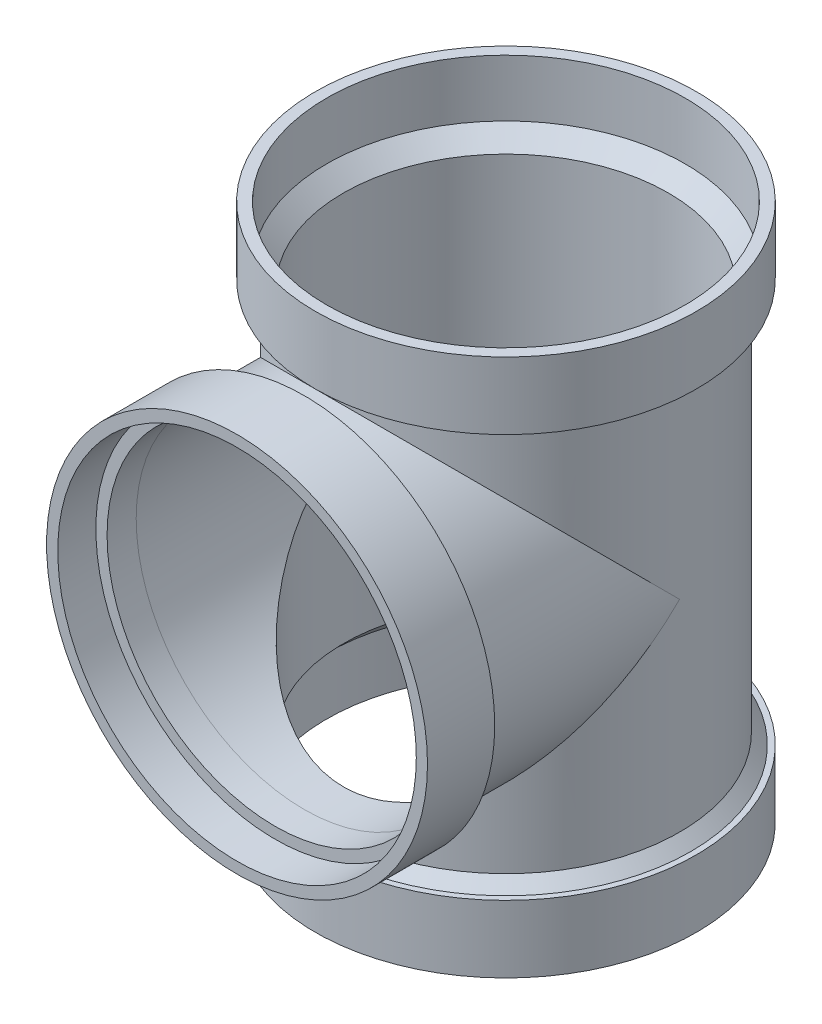
ISO-10303-21;
HEADER;
FILE_DESCRIPTION(('STEP AP214'),'2;1');
FILE_NAME('part.step','',(''),(''),'','','');
FILE_SCHEMA(('AUTOMOTIVE_DESIGN { 1 0 10303 214 1 1 1 1 }'));
ENDSEC;
DATA;
#1=APPLICATION_CONTEXT('core data for automotive mechanical design processes');
#2=APPLICATION_PROTOCOL_DEFINITION('international standard','automotive_design',2000,#1);
#3=PRODUCT_CONTEXT('',#1,'mechanical');
#4=PRODUCT('Part','Part','',(#3));
#5=PRODUCT_RELATED_PRODUCT_CATEGORY('part','',(#4));
#6=PRODUCT_DEFINITION_FORMATION('','',#4);
#7=PRODUCT_DEFINITION_CONTEXT('part definition',#1,'design');
#8=PRODUCT_DEFINITION('design','',#6,#7);
#9=PRODUCT_DEFINITION_SHAPE('','',#8);
#10=(LENGTH_UNIT() NAMED_UNIT(*) SI_UNIT(.MILLI.,.METRE.));
#11=(NAMED_UNIT(*) PLANE_ANGLE_UNIT() SI_UNIT($,.RADIAN.));
#12=(NAMED_UNIT(*) SI_UNIT($,.STERADIAN.) SOLID_ANGLE_UNIT());
#13=UNCERTAINTY_MEASURE_WITH_UNIT(LENGTH_MEASURE(1.E-05),#10,'distance_accuracy_value','');
#14=(GEOMETRIC_REPRESENTATION_CONTEXT(3) GLOBAL_UNCERTAINTY_ASSIGNED_CONTEXT((#13)) GLOBAL_UNIT_ASSIGNED_CONTEXT((#10,
#11,#12)) REPRESENTATION_CONTEXT('',''));
#15=CARTESIAN_POINT('',(0.,0.,0.));
#16=DIRECTION('',(0.,0.,1.));
#17=DIRECTION('',(1.,0.,0.));
#18=AXIS2_PLACEMENT_3D('',#15,#16,#17);
#19=CARTESIAN_POINT('',(0.,95.,120.));
#20=DIRECTION('',(0.,0.,-1.));
#21=DIRECTION('',(-1.,0.,0.));
#22=AXIS2_PLACEMENT_3D('',#19,#20,#21);
#23=CYLINDRICAL_SURFACE('',#22,85.);
#24=CARTESIAN_POINT('',(0.,95.,120.));
#25=DIRECTION('',(0.,0.,1.));
#26=DIRECTION('',(1.,0.,0.));
#27=AXIS2_PLACEMENT_3D('',#24,#25,#26);
#28=CIRCLE('',#27,85.);
#29=CARTESIAN_POINT('',(85.,95.,120.));
#30=VERTEX_POINT('',#29);
#31=EDGE_CURVE('E11',#30,#30,#28,.T.);
#32=ORIENTED_EDGE('',*,*,#31,.F.);
#33=EDGE_LOOP('',(#32));
#34=FACE_BOUND('',#33,.T.);
#35=CARTESIAN_POINT('',(0.,95.,90.));
#36=DIRECTION('',(0.,0.,1.));
#37=DIRECTION('',(1.,0.,0.));
#38=AXIS2_PLACEMENT_3D('',#35,#36,#37);
#39=CIRCLE('',#38,85.);
#40=CARTESIAN_POINT('',(85.,95.,90.));
#41=VERTEX_POINT('',#40);
#42=EDGE_CURVE('E43',#41,#41,#39,.T.);
#43=ORIENTED_EDGE('',*,*,#42,.T.);
#44=EDGE_LOOP('',(#43));
#45=FACE_BOUND('',#44,.T.);
#46=ADVANCED_FACE('F40',(#34,#45),#23,.T.);
#47=CARTESIAN_POINT('',(0.,95.,120.));
#48=DIRECTION('',(0.,0.,1.));
#49=DIRECTION('',(1.,0.,0.));
#50=AXIS2_PLACEMENT_3D('',#47,#48,#49);
#51=PLANE('',#50);
#52=CARTESIAN_POINT('',(0.,95.,120.));
#53=DIRECTION('',(0.,0.,1.));
#54=DIRECTION('',(1.,0.,0.));
#55=AXIS2_PLACEMENT_3D('',#52,#53,#54);
#56=CIRCLE('',#55,80.);
#57=CARTESIAN_POINT('',(80.,95.,120.));
#58=VERTEX_POINT('',#57);
#59=EDGE_CURVE('E52',#58,#58,#56,.T.);
#60=ORIENTED_EDGE('',*,*,#59,.F.);
#61=EDGE_LOOP('',(#60));
#62=FACE_BOUND('',#61,.T.);
#63=ORIENTED_EDGE('',*,*,#31,.T.);
#64=EDGE_LOOP('',(#63));
#65=FACE_BOUND('',#64,.T.);
#66=ADVANCED_FACE('F80',(#62,#65),#51,.T.);
#67=CARTESIAN_POINT('',(0.,95.,90.));
#68=DIRECTION('',(0.,0.,1.));
#69=DIRECTION('',(1.,0.,0.));
#70=AXIS2_PLACEMENT_3D('',#67,#68,#69);
#71=PLANE('',#70);
#72=CARTESIAN_POINT('',(0.,95.,90.));
#73=DIRECTION('',(0.,0.,1.));
#74=DIRECTION('',(1.,0.,0.));
#75=AXIS2_PLACEMENT_3D('',#72,#73,#74);
#76=CIRCLE('',#75,75.);
#77=CARTESIAN_POINT('',(75.0000000000001,95.,90.));
#78=VERTEX_POINT('',#77);
#79=EDGE_CURVE('E55',#78,#78,#76,.T.);
#80=ORIENTED_EDGE('',*,*,#79,.T.);
#81=EDGE_LOOP('',(#80));
#82=FACE_BOUND('',#81,.T.);
#83=ORIENTED_EDGE('',*,*,#42,.F.);
#84=EDGE_LOOP('',(#83));
#85=FACE_BOUND('',#84,.T.);
#86=ADVANCED_FACE('F76',(#82,#85),#71,.F.);
#87=CARTESIAN_POINT('',(0.,95.,103.));
#88=DIRECTION('',(0.,0.,1.));
#89=DIRECTION('',(1.,0.,0.));
#90=AXIS2_PLACEMENT_3D('',#87,#88,#89);
#91=CYLINDRICAL_SURFACE('',#90,80.);
#92=CARTESIAN_POINT('',(0.,95.,103.));
#93=DIRECTION('',(0.,0.,1.));
#94=DIRECTION('',(1.,0.,0.));
#95=AXIS2_PLACEMENT_3D('',#92,#93,#94);
#96=CIRCLE('',#95,80.);
#97=CARTESIAN_POINT('',(80.,95.,103.));
#98=VERTEX_POINT('',#97);
#99=EDGE_CURVE('E50',#98,#98,#96,.T.);
#100=ORIENTED_EDGE('',*,*,#99,.F.);
#101=EDGE_LOOP('',(#100));
#102=FACE_BOUND('',#101,.T.);
#103=ORIENTED_EDGE('',*,*,#59,.T.);
#104=EDGE_LOOP('',(#103));
#105=FACE_BOUND('',#104,.T.);
#106=ADVANCED_FACE('F70',(#102,#105),#91,.F.);
#107=CARTESIAN_POINT('',(0.,95.,103.));
#108=DIRECTION('',(0.,0.,1.));
#109=DIRECTION('',(1.,0.,0.));
#110=AXIS2_PLACEMENT_3D('',#107,#108,#109);
#111=PLANE('',#110);
#112=CARTESIAN_POINT('',(0.,95.,103.));
#113=DIRECTION('',(0.,0.,1.));
#114=DIRECTION('',(1.,0.,0.));
#115=AXIS2_PLACEMENT_3D('',#112,#113,#114);
#116=CIRCLE('',#115,75.);
#117=CARTESIAN_POINT('',(75.0000000000001,95.,103.));
#118=VERTEX_POINT('',#117);
#119=EDGE_CURVE('E60',#118,#118,#116,.T.);
#120=ORIENTED_EDGE('',*,*,#119,.F.);
#121=EDGE_LOOP('',(#120));
#122=FACE_BOUND('',#121,.T.);
#123=ORIENTED_EDGE('',*,*,#99,.T.);
#124=EDGE_LOOP('',(#123));
#125=FACE_BOUND('',#124,.T.);
#126=ADVANCED_FACE('F67',(#122,#125),#111,.T.);
#127=CARTESIAN_POINT('',(0.,95.,86.));
#128=DIRECTION('',(0.,0.,1.));
#129=DIRECTION('',(1.,0.,0.));
#130=AXIS2_PLACEMENT_3D('',#127,#128,#129);
#131=CYLINDRICAL_SURFACE('',#130,75.);
#132=ORIENTED_EDGE('',*,*,#119,.T.);
#133=EDGE_LOOP('',(#132));
#134=FACE_BOUND('',#133,.T.);
#135=ORIENTED_EDGE('',*,*,#79,.F.);
#136=EDGE_LOOP('',(#135));
#137=FACE_BOUND('',#136,.T.);
#138=ADVANCED_FACE('F64',(#134,#137),#131,.F.);
#139=CLOSED_SHELL('',(#46,#66,#86,#106,#126,#138));
#140=MANIFOLD_SOLID_BREP('B2',#139);
#141=CARTESIAN_POINT('',(0.,180.,0.));
#142=DIRECTION('',(0.,-1.,0.));
#143=DIRECTION('',(0.,0.,-1.));
#144=AXIS2_PLACEMENT_3D('',#141,#142,#143);
#145=CYLINDRICAL_SURFACE('',#144,72.5);
#146=CARTESIAN_POINT('',(0.,177.071067811866,0.));
#147=DIRECTION('',(0.,1.,0.));
#148=DIRECTION('',(0.,0.,1.));
#149=AXIS2_PLACEMENT_3D('',#146,#147,#148);
#150=CIRCLE('',#149,72.5);
#151=CARTESIAN_POINT('',(0.,177.071067811866,72.5));
#152=VERTEX_POINT('',#151);
#153=EDGE_CURVE('E215',#152,#152,#150,.F.);
#154=ORIENTED_EDGE('',*,*,#153,.F.);
#155=EDGE_LOOP('',(#154));
#156=FACE_BOUND('',#155,.T.);
#157=CARTESIAN_POINT('',(0.,2.92893218813436,0.));
#158=DIRECTION('',(0.,-1.,0.));
#159=DIRECTION('',(0.,0.,-1.));
#160=AXIS2_PLACEMENT_3D('',#157,#158,#159);
#161=CIRCLE('',#160,72.5);
#162=CARTESIAN_POINT('',(0.,2.92893218813436,-72.5));
#163=VERTEX_POINT('',#162);
#164=EDGE_CURVE('E218',#163,#163,#161,.F.);
#165=ORIENTED_EDGE('',*,*,#164,.F.);
#166=EDGE_LOOP('',(#165));
#167=FACE_BOUND('',#166,.T.);
#168=CARTESIAN_POINT('',(-72.2512975662029,115.118399538731,5.99999999999999));
#169=CARTESIAN_POINT('',(-72.1896320592226,115.340001407671,6.74218732700312));
#170=CARTESIAN_POINT('',(-72.1175107104839,115.594968131052,7.47239234819426));
#171=CARTESIAN_POINT('',(-71.9542741023039,116.158125522939,8.90810881758213));
#172=CARTESIAN_POINT('',(-71.8632006292488,116.466198847667,9.61367066865861));
#173=CARTESIAN_POINT('',(-71.6643548158217,117.120964697219,10.9979971452176));
#174=CARTESIAN_POINT('',(-71.5566972369384,117.467387528215,11.6769084655194));
#175=CARTESIAN_POINT('',(-71.3253564543341,118.191332700096,13.0155748670471));
#176=CARTESIAN_POINT('',(-71.2016634047975,118.568874095549,13.6753178716912));
#177=CARTESIAN_POINT('',(-70.9399904567028,119.345113869486,14.97342128723));
#178=CARTESIAN_POINT('',(-70.802105499489,119.743663933769,15.6118902437345));
#179=CARTESIAN_POINT('',(-70.5119709410956,120.558739586386,16.8739805279914));
#180=CARTESIAN_POINT('',(-70.3597194211835,120.975267571726,17.4975998585273));
#181=CARTESIAN_POINT('',(-70.0409324309957,121.822999069983,18.7330082132028));
#182=CARTESIAN_POINT('',(-69.8743680525556,122.254231169603,19.3447700840935));
#183=CARTESIAN_POINT('',(-69.5274802276591,123.127396615613,20.556667183985));
#184=CARTESIAN_POINT('',(-69.3471558711446,123.569330668487,21.1568016406742));
#185=CARTESIAN_POINT('',(-68.791975141717,124.892603646989,22.9220549762271));
#186=CARTESIAN_POINT('',(-68.3976209879667,125.785611916961,24.0723525973401));
#187=CARTESIAN_POINT('',(-67.556878216792,127.589258074251,26.3396910601553));
#188=CARTESIAN_POINT('',(-67.1104821712687,128.499898462749,27.4567271256978));
#189=CARTESIAN_POINT('',(-66.1657015592968,130.329302100948,29.6612109536074));
#190=CARTESIAN_POINT('',(-65.6673310689152,131.248063089998,30.7486666270605));
#191=CARTESIAN_POINT('',(-64.6180836807082,133.087061201911,32.8965272492471));
#192=CARTESIAN_POINT('',(-64.0672097779804,134.007298237631,33.9569337366529));
#193=CARTESIAN_POINT('',(-62.9090049151822,135.849078717394,36.057642928206));
#194=CARTESIAN_POINT('',(-62.3013753201631,136.77060066326,37.0977999552434));
#195=CARTESIAN_POINT('',(-61.0314120607563,138.605177850855,39.1519446795182));
#196=CARTESIAN_POINT('',(-60.3690767952886,139.518232843909,40.1659316096903));
#197=CARTESIAN_POINT('',(-58.9889092649662,141.331484622859,42.1667542676614));
#198=CARTESIAN_POINT('',(-58.2710913153475,142.231684654952,43.1535969105246));
#199=CARTESIAN_POINT('',(-56.7788553033177,144.015444045273,45.0989372347732));
#200=CARTESIAN_POINT('',(-56.0044409395424,144.899004486179,46.0574367626713));
#201=CARTESIAN_POINT('',(-53.9967366967416,147.081836813142,48.4154389340264));
#202=CARTESIAN_POINT('',(-52.7273691905947,148.36843544815,49.7962177244006));
#203=CARTESIAN_POINT('',(-50.0553548068224,150.882247148154,52.4814027395546));
#204=CARTESIAN_POINT('',(-48.6527128802215,152.109462416636,53.7858117984938));
#205=CARTESIAN_POINT('',(-46.4493382362236,153.892687558977,55.6744214797132));
#206=CARTESIAN_POINT('',(-45.6993822892687,154.476752259101,56.2918422500715));
#207=CARTESIAN_POINT('',(-44.1655563314284,155.624425115293,57.503117245975));
#208=CARTESIAN_POINT('',(-43.3816886250874,156.188034656662,58.0969730676836));
#209=CARTESIAN_POINT('',(-41.780188331391,157.292549701151,59.2591290888245));
#210=CARTESIAN_POINT('',(-40.9625658772732,157.833461921129,59.8274368523415));
#211=CARTESIAN_POINT('',(-39.2932572361983,158.89065913119,60.9368080899365));
#212=CARTESIAN_POINT('',(-38.441562631805,159.406937965718,61.4778647561883));
#213=CARTESIAN_POINT('',(-36.2278673716127,160.688331737461,62.8193055723285));
#214=CARTESIAN_POINT('',(-34.842258877126,161.434564105032,63.5991048158266));
#215=CARTESIAN_POINT('',(-31.992791780489,162.852724959347,65.0790829405953));
#216=CARTESIAN_POINT('',(-30.5289520732796,163.524671268931,65.7792809210872));
#217=CARTESIAN_POINT('',(-28.2777573824153,164.469645496383,66.7629380776318));
#218=CARTESIAN_POINT('',(-27.5179517306961,164.774204362715,67.0797777192118));
#219=CARTESIAN_POINT('',(-25.9806398250023,165.361089912641,67.6900286234472));
#220=CARTESIAN_POINT('',(-25.2031363523383,165.643420058928,67.9834435352037));
#221=CARTESIAN_POINT('',(-23.6311848381942,166.184676853794,68.5457074688372));
#222=CARTESIAN_POINT('',(-22.8367351576028,166.443601225661,68.8145541009513));
#223=CARTESIAN_POINT('',(-21.2319902370651,166.936827850582,69.3264877442858));
#224=CARTESIAN_POINT('',(-20.4216943312033,167.171129066233,69.5695736701813));
#225=CARTESIAN_POINT('',(-18.7790546070841,167.615960629208,70.0309325709879));
#226=CARTESIAN_POINT('',(-17.9465768595154,167.826253736602,70.2489580302815));
#227=CARTESIAN_POINT('',(-16.2682785792041,168.219436604842,70.6564842610258));
#228=CARTESIAN_POINT('',(-15.4224583143324,168.402326915067,70.8459856043369));
#229=CARTESIAN_POINT('',(-13.7190794734508,168.739681958581,71.195454740981));
#230=CARTESIAN_POINT('',(-12.8615204491686,168.894145603059,71.3554214030638));
#231=CARTESIAN_POINT('',(-11.136524654221,169.173723400368,71.6449066777339));
#232=CARTESIAN_POINT('',(-10.2690878952799,169.298837588031,71.7744253264574));
#233=CARTESIAN_POINT('',(-8.52704743184176,169.51885389158,72.0021558588007));
#234=CARTESIAN_POINT('',(-7.65245030869722,169.613781119988,72.1003937649507));
#235=CARTESIAN_POINT('',(-5.89747734616806,169.77296347453,72.2651127126968));
#236=CARTESIAN_POINT('',(-5.0171014572373,169.837218337334,72.3315934816511));
#237=CARTESIAN_POINT('',(-3.252904502853,169.934631492445,72.4323764882055));
#238=CARTESIAN_POINT('',(-2.36908388326904,169.967793683254,72.4666827599515));
#239=CARTESIAN_POINT('',(-0.600178896359542,170.002815032424,72.5029122541436));
#240=CARTESIAN_POINT('',(0.284905421928368,170.004675374113,72.5048367007445));
#241=CARTESIAN_POINT('',(1.92733973806951,169.979063694866,72.4783415870749));
#242=CARTESIAN_POINT('',(2.68483053840762,169.955754148818,72.4542280625029));
#243=CARTESIAN_POINT('',(4.197707191051,169.88626490592,72.3823373289776));
#244=CARTESIAN_POINT('',(4.95309286374434,169.840083314259,72.3345581594682));
#245=CARTESIAN_POINT('',(6.46011874137558,169.7250817506,72.2155667138044));
#246=CARTESIAN_POINT('',(7.21175971067282,169.65626660827,72.1443594368636));
#247=CARTESIAN_POINT('',(8.71017283892778,169.496313201458,71.978824207882));
#248=CARTESIAN_POINT('',(9.45694451119471,169.405172739615,71.8844939799729));
#249=CARTESIAN_POINT('',(10.9441958047331,169.20099629057,71.6731372133136));
#250=CARTESIAN_POINT('',(11.6846759667507,169.087962205376,71.5561126461342));
#251=CARTESIAN_POINT('',(13.1582066694996,168.840504231552,71.2998679160395));
#252=CARTESIAN_POINT('',(13.8912564822561,168.706078268231,71.1606456002737));
#253=CARTESIAN_POINT('',(16.0774239740364,168.271567224333,70.7105278615264));
#254=CARTESIAN_POINT('',(17.5178887602305,167.940203480804,70.3671345598543));
#255=CARTESIAN_POINT('',(20.3498279161734,167.201231210897,69.6008477244037));
#256=CARTESIAN_POINT('',(21.7414919306533,166.793968890796,69.178315136947));
#257=CARTESIAN_POINT('',(24.4764751388697,165.908166762384,68.2585777265714));
#258=CARTESIAN_POINT('',(25.8197961219495,165.429629595578,67.7613756709596));
#259=CARTESIAN_POINT('',(28.4537042017601,164.407372528501,66.6982359720379));
#260=CARTESIAN_POINT('',(29.7442760918068,163.863634007018,66.1322786919377));
#261=CARTESIAN_POINT('',(32.2692592613967,162.717189804734,64.9376317875545));
#262=CARTESIAN_POINT('',(33.5036585165944,162.114471584886,64.3089288230103));
#263=CARTESIAN_POINT('',(35.6047461262862,161.017604480351,63.163233045157));
#264=CARTESIAN_POINT('',(36.484579046668,160.535231047691,62.6589181000024));
#265=CARTESIAN_POINT('',(38.2111125021466,159.543797485095,61.621223773295));
#266=CARTESIAN_POINT('',(39.0578188386227,159.034742064779,61.0878495203291));
#267=CARTESIAN_POINT('',(41.5486824400541,157.470407994246,59.4467128219307));
#268=CARTESIAN_POINT('',(43.1431925736698,156.378167860431,58.2981517148027));
#269=CARTESIAN_POINT('',(46.200772108764,154.111068130151,55.9062964918539));
#270=CARTESIAN_POINT('',(47.6636348604648,152.93608362881,54.6628589105079));
#271=CARTESIAN_POINT('',(50.4574154459219,150.519896764381,52.0950892096274));
#272=CARTESIAN_POINT('',(51.7883389675483,149.278697259358,50.7707605812688));
#273=CARTESIAN_POINT('',(53.9126906113976,147.152621247478,48.4897609378488));
#274=CARTESIAN_POINT('',(54.7410889929162,146.281850591869,47.5521794087284));
#275=CARTESIAN_POINT('',(56.3398015513494,144.520112463766,45.646724854654));
#276=CARTESIAN_POINT('',(57.1101114114206,143.629143496623,44.678849585972));
#277=CARTESIAN_POINT('',(58.5939901681429,141.830590831933,42.7142901803575));
#278=CARTESIAN_POINT('',(59.3075288453804,140.922998597823,41.7175910802361));
#279=CARTESIAN_POINT('',(60.6784575548731,139.095683172028,39.6971684389369));
#280=CARTESIAN_POINT('',(61.3358492072697,138.175960331259,38.6734456786527));
#281=CARTESIAN_POINT('',(62.5977299595038,136.325329422128,36.5958573242087));
#282=CARTESIAN_POINT('',(63.2020218421131,135.394393146146,35.5418971766037));
#283=CARTESIAN_POINT('',(64.3559561010756,133.529381871512,33.4070858693088));
#284=CARTESIAN_POINT('',(64.9055957817513,132.595306720386,32.3262333864594));
#285=CARTESIAN_POINT('',(65.9504902962255,130.730573686854,30.1372338307803));
#286=CARTESIAN_POINT('',(66.4457853998774,129.799913774817,29.0291077237309));
#287=CARTESIAN_POINT('',(67.3828098512891,127.948939301659,26.7822450017147));
#288=CARTESIAN_POINT('',(67.8245463255615,127.028623378983,25.6435124839257));
#289=CARTESIAN_POINT('',(68.6404055202853,125.23949182511,23.3699408821966));
#290=CARTESIAN_POINT('',(69.0163199356357,124.369990102892,22.2362926137626));
#291=CARTESIAN_POINT('',(69.5423493868561,123.090482784491,20.5054841399503));
#292=CARTESIAN_POINT('',(69.7114370816318,122.66796367715,19.9232867690846));
#293=CARTESIAN_POINT('',(70.0367693974224,121.833768276253,18.747616839373));
#294=CARTESIAN_POINT('',(70.1930142178879,121.422091814379,18.1541444558051));
#295=CARTESIAN_POINT('',(70.4909708017723,120.616512850392,16.9601887089593));
#296=CARTESIAN_POINT('',(70.632806453159,120.222478714,16.3598253923411));
#297=CARTESIAN_POINT('',(70.9032453898772,119.451921420445,15.1448731257635));
#298=CARTESIAN_POINT('',(71.0318470645005,119.075400397853,14.5302824553165));
#299=CARTESIAN_POINT('',(71.2750730297203,118.345486283199,13.2859087633093));
#300=CARTESIAN_POINT('',(71.3897161586595,117.992062324956,12.6561476229773));
#301=CARTESIAN_POINT('',(71.6044165865293,117.314427284777,11.3787852998124));
#302=CARTESIAN_POINT('',(71.7044795510971,116.990204874352,10.7311911635551));
#303=CARTESIAN_POINT('',(71.8428054952445,116.532227978827,9.74531849589443));
#304=CARTESIAN_POINT('',(71.8869393723582,116.384341811011,9.41439872685337));
#305=CARTESIAN_POINT('',(71.971134594607,116.0992380139,8.74749970236861));
#306=CARTESIAN_POINT('',(72.0111963191463,115.962019390987,8.41152092163009));
#307=CARTESIAN_POINT('',(72.087256734937,115.698943486934,7.73269879245083));
#308=CARTESIAN_POINT('',(72.1232339565262,115.573146879327,7.38982940097658));
#309=CARTESIAN_POINT('',(72.190694736308,115.335165056385,6.69881798918418));
#310=CARTESIAN_POINT('',(72.2221764845696,115.222985326077,6.35067390725921));
#311=CARTESIAN_POINT('',(72.2512975662029,115.118399538731,5.99999999999997));
#312=B_SPLINE_CURVE_WITH_KNOTS('',3,(#168,#169,#170,#171,#172,#173,#174,#175,#176,#177,#178,
#179,#180,#181,#182,#183,#184,#185,#186,#187,#188,#189,#190,#191,#192,#193,#194,#195,#196,#197,
#198,#199,#200,#201,#202,#203,#204,#205,#206,#207,#208,#209,#210,#211,#212,#213,#214,#215,#216,
#217,#218,#219,#220,#221,#222,#223,#224,#225,#226,#227,#228,#229,#230,#231,#232,#233,#234,#235,
#236,#237,#238,#239,#240,#241,#242,#243,#244,#245,#246,#247,#248,#249,#250,#251,#252,#253,#254,
#255,#256,#257,#258,#259,#260,#261,#262,#263,#264,#265,#266,#267,#268,#269,#270,#271,#272,#273,
#274,#275,#276,#277,#278,#279,#280,#281,#282,#283,#284,#285,#286,#287,#288,#289,#290,#291,#292,
#293,#294,#295,#296,#297,#298,#299,#300,#301,#302,#303,#304,#305,#306,#307,#308,#309,#310,#311),
.UNSPECIFIED.,.F.,.F.,(4,2,2,2,2,2,2,2,2,2,2,2,2,2,2,2,2,2,2,2,2,2,2,2,2,2,2,2,2,2,2,2,2,2,2,2,
2,2,2,2,2,2,2,2,2,2,2,2,2,2,2,2,2,2,2,2,2,2,2,2,2,2,2,2,2,2,2,2,2,2,2,4),(0.,2.32858842888763,
4.6520960835242,6.96019308350509,9.26971403253767,11.5646813822946,13.8599556723906,
16.1599799648101,18.460156508414,22.9845345124142,27.5095590872475,32.0333613315611,
36.5569056663894,41.1057594371512,45.6547463871972,50.2025635338896,54.7500837412008,
61.5678486505753,68.385360385082,71.7850198284063,75.184448602572,78.5828641788943,
81.9821245733459,87.2463665311954,92.5093427292857,95.1419558085128,97.7741579761255,
100.406615906793,103.039184701565,105.695852778207,108.352467586029,111.009184127572,
113.665897516063,116.320394968405,118.974915209762,121.629102574,124.283189599746,
126.557190243335,128.831379305692,131.105083403924,133.379011380596,135.652741898204,
137.92669306806,142.473591996702,147.000236833881,151.526713951544,156.054486903459,
160.58322455712,163.951034346203,167.318251674372,174.054157903687,180.800459633947,
187.546470406084,192.117993945155,196.689856882475,201.264137372522,205.838285825537,
210.428762140063,215.019464764074,219.606742326175,224.193408833575,228.623704087291,
230.840375082804,233.05701164677,235.252604533933,237.448464331597,239.641326969616,
241.833335207961,242.928575011013,244.02371267642,245.124363544888,246.225456306544),.UNSPECIFIED.);
#313=CARTESIAN_POINT('',(-72.2512975662029,115.118399538731,5.99999999999999));
#314=VERTEX_POINT('',#313);
#315=CARTESIAN_POINT('',(72.2512975662029,115.118399538731,5.99999999999999));
#316=VERTEX_POINT('',#315);
#317=EDGE_CURVE('E173',#314,#316,#312,.T.);
#318=ORIENTED_EDGE('',*,*,#317,.F.);
#319=DIRECTION('',(0.,-1.,0.));
#320=VECTOR('',#319,1.);
#321=CARTESIAN_POINT('',(-72.2512975662029,180.,5.99999999999999));
#322=LINE('',#321,#320);
#323=CARTESIAN_POINT('',(-72.2512975662029,74.8816004612691,5.99999999999999));
#324=VERTEX_POINT('',#323);
#325=EDGE_CURVE('E38',#314,#324,#322,.T.);
#326=ORIENTED_EDGE('',*,*,#325,.T.);
#327=CARTESIAN_POINT('',(72.2512975662029,74.8816004612691,5.99999999999999));
#328=CARTESIAN_POINT('',(72.1896320592226,74.6599985923288,6.74218732700311));
#329=CARTESIAN_POINT('',(72.1175107104839,74.4050318689478,7.47239234819426));
#330=CARTESIAN_POINT('',(71.9542741023039,73.8418744770614,8.90810881758214));
#331=CARTESIAN_POINT('',(71.8632006292487,73.5338011523326,9.61367066865862));
#332=CARTESIAN_POINT('',(71.6643548158217,72.8790353027814,10.9979971452176));
#333=CARTESIAN_POINT('',(71.5566972369384,72.5326124717852,11.6769084655194));
#334=CARTESIAN_POINT('',(71.3253564543341,71.8086672999036,13.0155748670471));
#335=CARTESIAN_POINT('',(71.2016634047975,71.4311259044508,13.6753178716912));
#336=CARTESIAN_POINT('',(70.9399904567028,70.6548861305145,14.97342128723));
#337=CARTESIAN_POINT('',(70.802105499489,70.2563360662309,15.6118902437345));
#338=CARTESIAN_POINT('',(70.5119709410956,69.4412604136139,16.8739805279914));
#339=CARTESIAN_POINT('',(70.3597194211835,69.0247324282737,17.4975998585273));
#340=CARTESIAN_POINT('',(70.0409324309957,68.1770009300167,18.7330082132028));
#341=CARTESIAN_POINT('',(69.8743680525556,67.7457688303968,19.3447700840935));
#342=CARTESIAN_POINT('',(69.5274802276591,66.8726033843871,20.556667183985));
#343=CARTESIAN_POINT('',(69.3471558711446,66.4306693315128,21.1568016406742));
#344=CARTESIAN_POINT('',(68.7919751417171,65.1073963530112,22.9220549762271));
#345=CARTESIAN_POINT('',(68.3976209879667,64.2143880830394,24.0723525973401));
#346=CARTESIAN_POINT('',(67.5568782167921,62.4107419257491,26.3396910601552));
#347=CARTESIAN_POINT('',(67.1104821712688,61.5001015372509,27.4567271256977));
#348=CARTESIAN_POINT('',(66.1657015592968,59.6706978990518,29.6612109536074));
#349=CARTESIAN_POINT('',(65.6673310689152,58.7519369100016,30.7486666270605));
#350=CARTESIAN_POINT('',(64.6180836807082,56.9129387980885,32.8965272492471));
#351=CARTESIAN_POINT('',(64.0672097779804,55.9927017623687,33.9569337366529));
#352=CARTESIAN_POINT('',(62.9090049151822,54.1509212826059,36.057642928206));
#353=CARTESIAN_POINT('',(62.3013753201631,53.2293993367397,37.0977999552434));
#354=CARTESIAN_POINT('',(61.0314120607563,51.3948221491451,39.1519446795182));
#355=CARTESIAN_POINT('',(60.3690767952886,50.4817671560909,40.1659316096902));
#356=CARTESIAN_POINT('',(58.9889092649662,48.6685153771408,42.1667542676613));
#357=CARTESIAN_POINT('',(58.2710913153475,47.7683153450484,43.1535969105246));
#358=CARTESIAN_POINT('',(56.7788553033177,45.984555954727,45.0989372347731));
#359=CARTESIAN_POINT('',(56.0044409395424,45.1009955138208,46.0574367626712));
#360=CARTESIAN_POINT('',(53.9967366967417,42.9181631868581,48.4154389340263));
#361=CARTESIAN_POINT('',(52.7273691905948,41.6315645518505,49.7962177244006));
#362=CARTESIAN_POINT('',(50.0553548068224,39.1177528518458,52.4814027395546));
#363=CARTESIAN_POINT('',(48.6527128802215,37.8905375833644,53.7858117984938));
#364=CARTESIAN_POINT('',(46.4493382362236,36.1073124410228,55.6744214797132));
#365=CARTESIAN_POINT('',(45.6993822892687,35.5232477408989,56.2918422500715));
#366=CARTESIAN_POINT('',(44.1655563314284,34.3755748847072,57.503117245975));
#367=CARTESIAN_POINT('',(43.3816886250874,33.8119653433383,58.0969730676836));
#368=CARTESIAN_POINT('',(41.780188331391,32.7074502988494,59.2591290888245));
#369=CARTESIAN_POINT('',(40.9625658772732,32.166538078871,59.8274368523415));
#370=CARTESIAN_POINT('',(39.2932572361983,31.1093408688102,60.9368080899365));
#371=CARTESIAN_POINT('',(38.441562631805,30.5930620342816,61.4778647561883));
#372=CARTESIAN_POINT('',(36.2278673716127,29.3116682625392,62.8193055723285));
#373=CARTESIAN_POINT('',(34.8422588771261,28.5654358949677,63.5991048158266));
#374=CARTESIAN_POINT('',(31.992791780489,27.1472750406534,65.0790829405953));
#375=CARTESIAN_POINT('',(30.5289520732796,26.4753287310692,65.7792809210872));
#376=CARTESIAN_POINT('',(28.2777573824153,25.5303545036175,66.7629380776318));
#377=CARTESIAN_POINT('',(27.5179517306961,25.2257956372852,67.0797777192118));
#378=CARTESIAN_POINT('',(25.9806398250023,24.6389100873587,67.6900286234472));
#379=CARTESIAN_POINT('',(25.2031363523383,24.3565799410725,67.9834435352037));
#380=CARTESIAN_POINT('',(23.6311848381942,23.8153231462065,68.5457074688372));
#381=CARTESIAN_POINT('',(22.8367351576028,23.5563987743389,68.8145541009513));
#382=CARTESIAN_POINT('',(21.2319902370651,23.0631721494182,69.3264877442858));
#383=CARTESIAN_POINT('',(20.4216943312033,22.8288709337673,69.5695736701813));
#384=CARTESIAN_POINT('',(18.7790546070841,22.384039370792,70.0309325709879));
#385=CARTESIAN_POINT('',(17.9465768595154,22.1737462633979,70.2489580302815));
#386=CARTESIAN_POINT('',(16.2682785792041,21.780563395158,70.6564842610258));
#387=CARTESIAN_POINT('',(15.4224583143324,21.5976730849326,70.8459856043369));
#388=CARTESIAN_POINT('',(13.7190794734508,21.2603180414186,71.195454740981));
#389=CARTESIAN_POINT('',(12.8615204491686,21.1058543969413,71.3554214030638));
#390=CARTESIAN_POINT('',(11.136524654221,20.8262765996325,71.6449066777339));
#391=CARTESIAN_POINT('',(10.2690878952799,20.7011624119687,71.7744253264574));
#392=CARTESIAN_POINT('',(8.52704743184177,20.4811461084196,72.0021558588007));
#393=CARTESIAN_POINT('',(7.65245030869723,20.3862188800117,72.1003937649507));
#394=CARTESIAN_POINT('',(5.89747734616807,20.2270365254705,72.2651127126968));
#395=CARTESIAN_POINT('',(5.01710145723731,20.1627816626659,72.3315934816511));
#396=CARTESIAN_POINT('',(3.252904502853,20.0653685075553,72.4323764882055));
#397=CARTESIAN_POINT('',(2.36908388326904,20.0322063167465,72.4666827599515));
#398=CARTESIAN_POINT('',(0.600178896359544,19.997184967576,72.5029122541436));
#399=CARTESIAN_POINT('',(-0.284905421928371,19.9953246258865,72.5048367007445));
#400=CARTESIAN_POINT('',(-1.92733973806951,20.0209363051342,72.4783415870749));
#401=CARTESIAN_POINT('',(-2.68483053840761,20.0442458511821,72.4542280625029));
#402=CARTESIAN_POINT('',(-4.19770719105098,20.1137350940798,72.3823373289776));
#403=CARTESIAN_POINT('',(-4.95309286374432,20.1599166857407,72.3345581594682));
#404=CARTESIAN_POINT('',(-6.46011874137556,20.2749182493999,72.2155667138044));
#405=CARTESIAN_POINT('',(-7.21175971067279,20.3437333917302,72.1443594368636));
#406=CARTESIAN_POINT('',(-8.71017283892775,20.5036867985421,71.978824207882));
#407=CARTESIAN_POINT('',(-9.45694451119469,20.5948272603846,71.8844939799729));
#408=CARTESIAN_POINT('',(-10.9441958047331,20.7990037094302,71.6731372133136));
#409=CARTESIAN_POINT('',(-11.6846759667507,20.9120377946237,71.5561126461342));
#410=CARTESIAN_POINT('',(-13.1582066694996,21.1594957684478,71.2998679160395));
#411=CARTESIAN_POINT('',(-13.8912564822561,21.2939217317692,71.1606456002737));
#412=CARTESIAN_POINT('',(-16.0774239740364,21.7284327756668,70.7105278615264));
#413=CARTESIAN_POINT('',(-17.5178887602305,22.0597965191957,70.3671345598543));
#414=CARTESIAN_POINT('',(-20.3498279161734,22.7987687891031,69.6008477244037));
#415=CARTESIAN_POINT('',(-21.7414919306534,23.2060311092042,69.178315136947));
#416=CARTESIAN_POINT('',(-24.4764751388697,24.0918332376165,68.2585777265714));
#417=CARTESIAN_POINT('',(-25.8197961219495,24.5703704044224,67.7613756709596));
#418=CARTESIAN_POINT('',(-28.4537042017601,25.5926274714987,66.6982359720379));
#419=CARTESIAN_POINT('',(-29.7442760918068,26.1363659929824,66.1322786919377));
#420=CARTESIAN_POINT('',(-32.2692592613967,27.2828101952664,64.9376317875544));
#421=CARTESIAN_POINT('',(-33.5036585165944,27.8855284151143,64.3089288230103));
#422=CARTESIAN_POINT('',(-35.6047461262862,28.9823955196487,63.163233045157));
#423=CARTESIAN_POINT('',(-36.484579046668,29.4647689523094,62.6589181000023));
#424=CARTESIAN_POINT('',(-38.2111125021466,30.4562025149048,61.621223773295));
#425=CARTESIAN_POINT('',(-39.0578188386228,30.9652579352207,61.0878495203291));
#426=CARTESIAN_POINT('',(-41.5486824400541,32.5295920057538,59.4467128219307));
#427=CARTESIAN_POINT('',(-43.1431925736698,33.6218321395687,58.2981517148027));
#428=CARTESIAN_POINT('',(-46.200772108764,35.8889318698495,55.9062964918539));
#429=CARTESIAN_POINT('',(-47.6636348604649,37.0639163711897,54.6628589105079));
#430=CARTESIAN_POINT('',(-50.4574154459219,39.4801032356187,52.0950892096273));
#431=CARTESIAN_POINT('',(-51.7883389675483,40.7213027406424,50.7707605812688));
#432=CARTESIAN_POINT('',(-53.9126906113976,42.8473787525217,48.4897609378488));
#433=CARTESIAN_POINT('',(-54.7410889929162,43.7181494081312,47.5521794087283));
#434=CARTESIAN_POINT('',(-56.3398015513494,45.4798875362343,45.646724854654));
#435=CARTESIAN_POINT('',(-57.1101114114207,46.3708565033768,44.678849585972));
#436=CARTESIAN_POINT('',(-58.5939901681429,48.1694091680668,42.7142901803575));
#437=CARTESIAN_POINT('',(-59.3075288453804,49.0770014021766,41.7175910802361));
#438=CARTESIAN_POINT('',(-60.6784575548731,50.9043168279725,39.6971684389369));
#439=CARTESIAN_POINT('',(-61.3358492072697,51.824039668741,38.6734456786527));
#440=CARTESIAN_POINT('',(-62.5977299595038,53.6746705778719,36.5958573242087));
#441=CARTESIAN_POINT('',(-63.2020218421131,54.6056068538545,35.5418971766037));
#442=CARTESIAN_POINT('',(-64.3559561010756,56.4706181284876,33.4070858693088));
#443=CARTESIAN_POINT('',(-64.9055957817514,57.4046932796138,32.3262333864594));
#444=CARTESIAN_POINT('',(-65.9504902962255,59.2694263131466,30.1372338307802));
#445=CARTESIAN_POINT('',(-66.4457853998774,60.2000862251831,29.0291077237309));
#446=CARTESIAN_POINT('',(-67.3828098512891,62.0510606983416,26.7822450017147));
#447=CARTESIAN_POINT('',(-67.8245463255615,62.9713766210169,25.6435124839257));
#448=CARTESIAN_POINT('',(-68.6404055202853,64.7605081748903,23.3699408821965));
#449=CARTESIAN_POINT('',(-69.0163199356358,65.6300098971082,22.2362926137626));
#450=CARTESIAN_POINT('',(-69.5423493868561,66.9095172155088,20.5054841399503));
#451=CARTESIAN_POINT('',(-69.7114370816318,67.3320363228502,19.9232867690846));
#452=CARTESIAN_POINT('',(-70.0367693974224,68.1662317237467,18.747616839373));
#453=CARTESIAN_POINT('',(-70.1930142178879,68.5779081856213,18.154144455805));
#454=CARTESIAN_POINT('',(-70.4909708017724,69.3834871496084,16.9601887089592));
#455=CARTESIAN_POINT('',(-70.632806453159,69.7775212860006,16.359825392341));
#456=CARTESIAN_POINT('',(-70.9032453898772,70.5480785795554,15.1448731257635));
#457=CARTESIAN_POINT('',(-71.0318470645006,70.9245996021467,14.5302824553164));
#458=CARTESIAN_POINT('',(-71.2750730297204,71.6545137168011,13.2859087633092));
#459=CARTESIAN_POINT('',(-71.3897161586595,72.0079376750442,12.6561476229772));
#460=CARTESIAN_POINT('',(-71.6044165865293,72.6855727152236,11.3787852998123));
#461=CARTESIAN_POINT('',(-71.7044795510971,73.0097951256479,10.7311911635551));
#462=CARTESIAN_POINT('',(-71.8428054952445,73.4677720211736,9.7453184958944));
#463=CARTESIAN_POINT('',(-71.8869393723582,73.6156581889895,9.41439872685334));
#464=CARTESIAN_POINT('',(-71.971134594607,73.9007619861,8.74749970236856));
#465=CARTESIAN_POINT('',(-72.0111963191463,74.0379806090134,8.41152092163005));
#466=CARTESIAN_POINT('',(-72.087256734937,74.3010565130659,7.7326987924508));
#467=CARTESIAN_POINT('',(-72.1232339565262,74.4268531206732,7.38982940097656));
#468=CARTESIAN_POINT('',(-72.190694736308,74.6648349436153,6.69881798918418));
#469=CARTESIAN_POINT('',(-72.2221764845696,74.7770146739233,6.35067390725922));
#470=CARTESIAN_POINT('',(-72.2512975662029,74.8816004612691,5.99999999999995));
#471=B_SPLINE_CURVE_WITH_KNOTS('',3,(#327,#328,#329,#330,#331,#332,#333,#334,#335,#336,#337,
#338,#339,#340,#341,#342,#343,#344,#345,#346,#347,#348,#349,#350,#351,#352,#353,#354,#355,#356,
#357,#358,#359,#360,#361,#362,#363,#364,#365,#366,#367,#368,#369,#370,#371,#372,#373,#374,#375,
#376,#377,#378,#379,#380,#381,#382,#383,#384,#385,#386,#387,#388,#389,#390,#391,#392,#393,#394,
#395,#396,#397,#398,#399,#400,#401,#402,#403,#404,#405,#406,#407,#408,#409,#410,#411,#412,#413,
#414,#415,#416,#417,#418,#419,#420,#421,#422,#423,#424,#425,#426,#427,#428,#429,#430,#431,#432,
#433,#434,#435,#436,#437,#438,#439,#440,#441,#442,#443,#444,#445,#446,#447,#448,#449,#450,#451,
#452,#453,#454,#455,#456,#457,#458,#459,#460,#461,#462,#463,#464,#465,#466,#467,#468,#469,#470),
.UNSPECIFIED.,.F.,.F.,(4,2,2,2,2,2,2,2,2,2,2,2,2,2,2,2,2,2,2,2,2,2,2,2,2,2,2,2,2,2,2,2,2,2,2,2,
2,2,2,2,2,2,2,2,2,2,2,2,2,2,2,2,2,2,2,2,2,2,2,2,2,2,2,2,2,2,2,2,2,2,2,4),(0.,2.32858842888762,
4.65209608352421,6.96019308350509,9.26971403253764,11.5646813822945,13.8599556723906,
16.1599799648101,18.460156508414,22.9845345124141,27.5095590872475,32.033361331561,
36.5569056663894,41.1057594371511,45.6547463871971,50.2025635338895,54.7500837412007,
61.5678486505752,68.3853603850819,71.7850198284062,75.1844486025719,78.5828641788942,
81.9821245733459,87.2463665311954,92.5093427292856,95.1419558085127,97.7741579761255,
100.406615906793,103.039184701565,105.695852778207,108.352467586029,111.009184127572,
113.665897516063,116.320394968405,118.974915209762,121.629102574,124.283189599746,
126.557190243334,128.831379305692,131.105083403924,133.379011380596,135.652741898204,
137.92669306806,142.473591996702,147.000236833881,151.526713951544,156.054486903459,
160.58322455712,163.951034346203,167.318251674372,174.054157903687,180.800459633946,
187.546470406084,192.117993945155,196.689856882475,201.264137372522,205.838285825537,
210.428762140063,215.019464764074,219.606742326175,224.193408833575,228.623704087291,
230.840375082804,233.05701164677,235.252604533933,237.448464331597,239.641326969616,
241.833335207961,242.928575011013,244.02371267642,245.124363544888,246.225456306544),.UNSPECIFIED.);
#472=CARTESIAN_POINT('',(72.2512975662029,74.881600461269,5.99999999999999));
#473=VERTEX_POINT('',#472);
#474=EDGE_CURVE('E139',#473,#324,#471,.T.);
#475=ORIENTED_EDGE('',*,*,#474,.F.);
#476=DIRECTION('',(0.,-1.,0.));
#477=VECTOR('',#476,1.);
#478=CARTESIAN_POINT('',(72.2512975662029,180.,5.99999999999999));
#479=LINE('',#478,#477);
#480=EDGE_CURVE('E177',#473,#316,#479,.F.);
#481=ORIENTED_EDGE('',*,*,#480,.T.);
#482=EDGE_LOOP('',(#318,#326,#475,#481));
#483=FACE_BOUND('',#482,.T.);
#484=ADVANCED_FACE('F131',(#156,#167,#483),#145,.F.);
#485=CARTESIAN_POINT('',(0.,180.,0.));
#486=DIRECTION('',(0.,-1.,0.));
#487=DIRECTION('',(0.,0.,-1.));
#488=AXIS2_PLACEMENT_3D('',#485,#486,#487);
#489=CYLINDRICAL_SURFACE('',#488,77.5);
#490=CARTESIAN_POINT('',(0.,4.99999999999984,0.));
#491=DIRECTION('',(0.,-1.,0.));
#492=DIRECTION('',(0.,0.,-1.));
#493=AXIS2_PLACEMENT_3D('',#490,#491,#492);
#494=CIRCLE('',#493,77.5);
#495=CARTESIAN_POINT('',(0.,4.99999999999984,-77.5));
#496=VERTEX_POINT('',#495);
#497=EDGE_CURVE('E261',#496,#496,#494,.F.);
#498=ORIENTED_EDGE('',*,*,#497,.T.);
#499=EDGE_LOOP('',(#498));
#500=FACE_BOUND('',#499,.T.);
#501=CARTESIAN_POINT('',(0.,175.,0.));
#502=DIRECTION('',(0.,1.,0.));
#503=DIRECTION('',(0.,0.,1.));
#504=AXIS2_PLACEMENT_3D('',#501,#502,#503);
#505=CIRCLE('',#504,77.5);
#506=CARTESIAN_POINT('',(0.,175.,77.5));
#507=VERTEX_POINT('',#506);
#508=EDGE_CURVE('E258',#507,#507,#505,.F.);
#509=ORIENTED_EDGE('',*,*,#508,.T.);
#510=EDGE_LOOP('',(#509));
#511=FACE_BOUND('',#510,.T.);
#512=CARTESIAN_POINT('',(0.,95.,0.));
#513=DIRECTION('',(0.,-0.707106781186547,-0.707106781186547));
#514=DIRECTION('',(0.,-0.707106781186547,0.707106781186547));
#515=AXIS2_PLACEMENT_3D('',#512,#513,#514);
#516=ELLIPSE('',#515,109.601551083915,77.5);
#517=CARTESIAN_POINT('',(-77.5,95.,0.));
#518=VERTEX_POINT('',#517);
#519=CARTESIAN_POINT('',(77.5,95.,0.));
#520=VERTEX_POINT('',#519);
#521=EDGE_CURVE('E251',#518,#520,#516,.F.);
#522=ORIENTED_EDGE('',*,*,#521,.F.);
#523=CARTESIAN_POINT('',(0.,95.,0.));
#524=DIRECTION('',(0.,-0.707106781186547,0.707106781186547));
#525=DIRECTION('',(0.,-0.707106781186547,-0.707106781186547));
#526=AXIS2_PLACEMENT_3D('',#523,#524,#525);
#527=ELLIPSE('',#526,109.601551083915,77.5);
#528=EDGE_CURVE('E152',#520,#518,#527,.T.);
#529=ORIENTED_EDGE('',*,*,#528,.F.);
#530=EDGE_LOOP('',(#522,#529));
#531=FACE_BOUND('',#530,.T.);
#532=ADVANCED_FACE('F204',(#500,#511,#531),#489,.T.);
#533=CARTESIAN_POINT('',(0.,95.,90.));
#534=DIRECTION('',(0.,0.,-1.));
#535=DIRECTION('',(-1.,0.,0.));
#536=AXIS2_PLACEMENT_3D('',#533,#534,#535);
#537=CYLINDRICAL_SURFACE('',#536,77.5);
#538=CARTESIAN_POINT('',(0.,95.,90.));
#539=DIRECTION('',(0.,0.,1.));
#540=DIRECTION('',(1.,0.,0.));
#541=AXIS2_PLACEMENT_3D('',#538,#539,#540);
#542=CIRCLE('',#541,77.5);
#543=CARTESIAN_POINT('',(77.5,95.,90.));
#544=VERTEX_POINT('',#543);
#545=EDGE_CURVE('E245',#544,#544,#542,.T.);
#546=ORIENTED_EDGE('',*,*,#545,.F.);
#547=EDGE_LOOP('',(#546));
#548=FACE_BOUND('',#547,.T.);
#549=ORIENTED_EDGE('',*,*,#528,.T.);
#550=ORIENTED_EDGE('',*,*,#521,.T.);
#551=EDGE_LOOP('',(#549,#550));
#552=FACE_BOUND('',#551,.T.);
#553=ADVANCED_FACE('F209',(#548,#552),#537,.T.);
#554=CARTESIAN_POINT('',(0.,95.,90.));
#555=DIRECTION('',(0.,0.,1.));
#556=DIRECTION('',(1.,0.,0.));
#557=AXIS2_PLACEMENT_3D('',#554,#555,#556);
#558=PLANE('',#557);
#559=CARTESIAN_POINT('',(0.,95.,90.));
#560=DIRECTION('',(0.,0.,1.));
#561=DIRECTION('',(1.,0.,0.));
#562=AXIS2_PLACEMENT_3D('',#559,#560,#561);
#563=CIRCLE('',#562,75.);
#564=CARTESIAN_POINT('',(75.0000000000001,95.,90.));
#565=VERTEX_POINT('',#564);
#566=EDGE_CURVE('E223',#565,#565,#563,.T.);
#567=ORIENTED_EDGE('',*,*,#566,.F.);
#568=EDGE_LOOP('',(#567));
#569=FACE_BOUND('',#568,.T.);
#570=ORIENTED_EDGE('',*,*,#545,.T.);
#571=EDGE_LOOP('',(#570));
#572=FACE_BOUND('',#571,.T.);
#573=ADVANCED_FACE('F284',(#569,#572),#558,.T.);
#574=CARTESIAN_POINT('',(0.,0.,0.));
#575=DIRECTION('',(0.,-1.,0.));
#576=DIRECTION('',(0.,0.,-1.));
#577=AXIS2_PLACEMENT_3D('',#574,#575,#576);
#578=PLANE('',#577);
#579=CARTESIAN_POINT('',(0.,0.,0.));
#580=DIRECTION('',(0.,-1.,0.));
#581=DIRECTION('',(0.,0.,-1.));
#582=AXIS2_PLACEMENT_3D('',#579,#580,#581);
#583=CIRCLE('',#582,82.4999999999999);
#584=CARTESIAN_POINT('',(0.,0.,-82.4999999999999));
#585=VERTEX_POINT('',#584);
#586=EDGE_CURVE('E253',#585,#585,#583,.T.);
#587=ORIENTED_EDGE('',*,*,#586,.T.);
#588=EDGE_LOOP('',(#587));
#589=FACE_BOUND('',#588,.T.);
#590=CARTESIAN_POINT('',(0.,0.,0.));
#591=DIRECTION('',(0.,-1.,0.));
#592=DIRECTION('',(0.,0.,-1.));
#593=AXIS2_PLACEMENT_3D('',#590,#591,#592);
#594=CIRCLE('',#593,85.);
#595=CARTESIAN_POINT('',(0.,0.,-85.));
#596=VERTEX_POINT('',#595);
#597=EDGE_CURVE('E238',#596,#596,#594,.T.);
#598=ORIENTED_EDGE('',*,*,#597,.F.);
#599=EDGE_LOOP('',(#598));
#600=FACE_BOUND('',#599,.T.);
#601=ADVANCED_FACE('F290',(#589,#600),#578,.F.);
#602=CARTESIAN_POINT('',(0.,-30.,0.));
#603=DIRECTION('',(0.,1.,0.));
#604=DIRECTION('',(0.,0.,1.));
#605=AXIS2_PLACEMENT_3D('',#602,#603,#604);
#606=CYLINDRICAL_SURFACE('',#605,85.);
#607=CARTESIAN_POINT('',(0.,-30.,0.));
#608=DIRECTION('',(0.,-1.,0.));
#609=DIRECTION('',(0.,0.,-1.));
#610=AXIS2_PLACEMENT_3D('',#607,#608,#609);
#611=CIRCLE('',#610,85.);
#612=CARTESIAN_POINT('',(0.,-30.,-85.));
#613=VERTEX_POINT('',#612);
#614=EDGE_CURVE('E242',#613,#613,#611,.T.);
#615=ORIENTED_EDGE('',*,*,#614,.F.);
#616=EDGE_LOOP('',(#615));
#617=FACE_BOUND('',#616,.T.);
#618=ORIENTED_EDGE('',*,*,#597,.T.);
#619=EDGE_LOOP('',(#618));
#620=FACE_BOUND('',#619,.T.);
#621=ADVANCED_FACE('F295',(#617,#620),#606,.T.);
#622=CARTESIAN_POINT('',(0.,-30.,0.));
#623=DIRECTION('',(0.,-1.,0.));
#624=DIRECTION('',(0.,0.,-1.));
#625=AXIS2_PLACEMENT_3D('',#622,#623,#624);
#626=PLANE('',#625);
#627=CARTESIAN_POINT('',(0.,-30.,0.));
#628=DIRECTION('',(0.,-1.,0.));
#629=DIRECTION('',(0.,0.,-1.));
#630=AXIS2_PLACEMENT_3D('',#627,#628,#629);
#631=CIRCLE('',#630,80.);
#632=CARTESIAN_POINT('',(0.,-30.,-80.));
#633=VERTEX_POINT('',#632);
#634=EDGE_CURVE('E228',#633,#633,#631,.T.);
#635=ORIENTED_EDGE('',*,*,#634,.F.);
#636=EDGE_LOOP('',(#635));
#637=FACE_BOUND('',#636,.T.);
#638=ORIENTED_EDGE('',*,*,#614,.T.);
#639=EDGE_LOOP('',(#638));
#640=FACE_BOUND('',#639,.T.);
#641=ADVANCED_FACE('F298',(#637,#640),#626,.T.);
#642=CARTESIAN_POINT('',(0.,180.,0.));
#643=DIRECTION('',(0.,1.,0.));
#644=DIRECTION('',(0.,0.,1.));
#645=AXIS2_PLACEMENT_3D('',#642,#643,#644);
#646=PLANE('',#645);
#647=CARTESIAN_POINT('',(0.,180.,0.));
#648=DIRECTION('',(0.,1.,0.));
#649=DIRECTION('',(0.,0.,1.));
#650=AXIS2_PLACEMENT_3D('',#647,#648,#649);
#651=CIRCLE('',#650,82.4999999999999);
#652=CARTESIAN_POINT('',(0.,180.,82.4999999999999));
#653=VERTEX_POINT('',#652);
#654=EDGE_CURVE('E179',#653,#653,#651,.T.);
#655=ORIENTED_EDGE('',*,*,#654,.T.);
#656=EDGE_LOOP('',(#655));
#657=FACE_BOUND('',#656,.T.);
#658=CARTESIAN_POINT('',(0.,180.,0.));
#659=DIRECTION('',(0.,1.,0.));
#660=DIRECTION('',(0.,0.,1.));
#661=AXIS2_PLACEMENT_3D('',#658,#659,#660);
#662=CIRCLE('',#661,85.);
#663=CARTESIAN_POINT('',(0.,180.,85.));
#664=VERTEX_POINT('',#663);
#665=EDGE_CURVE('E239',#664,#664,#662,.T.);
#666=ORIENTED_EDGE('',*,*,#665,.F.);
#667=EDGE_LOOP('',(#666));
#668=FACE_BOUND('',#667,.T.);
#669=ADVANCED_FACE('F266',(#657,#668),#646,.F.);
#670=CARTESIAN_POINT('',(0.,210.,0.));
#671=DIRECTION('',(0.,-1.,0.));
#672=DIRECTION('',(0.,0.,-1.));
#673=AXIS2_PLACEMENT_3D('',#670,#671,#672);
#674=CYLINDRICAL_SURFACE('',#673,85.);
#675=CARTESIAN_POINT('',(0.,210.,0.));
#676=DIRECTION('',(0.,1.,0.));
#677=DIRECTION('',(0.,0.,1.));
#678=AXIS2_PLACEMENT_3D('',#675,#676,#677);
#679=CIRCLE('',#678,85.);
#680=CARTESIAN_POINT('',(0.,210.,85.));
#681=VERTEX_POINT('',#680);
#682=EDGE_CURVE('E235',#681,#681,#679,.T.);
#683=ORIENTED_EDGE('',*,*,#682,.F.);
#684=EDGE_LOOP('',(#683));
#685=FACE_BOUND('',#684,.T.);
#686=ORIENTED_EDGE('',*,*,#665,.T.);
#687=EDGE_LOOP('',(#686));
#688=FACE_BOUND('',#687,.T.);
#689=ADVANCED_FACE('F306',(#685,#688),#674,.T.);
#690=CARTESIAN_POINT('',(0.,210.,0.));
#691=DIRECTION('',(0.,1.,0.));
#692=DIRECTION('',(0.,0.,1.));
#693=AXIS2_PLACEMENT_3D('',#690,#691,#692);
#694=PLANE('',#693);
#695=CARTESIAN_POINT('',(0.,210.,0.));
#696=DIRECTION('',(0.,1.,0.));
#697=DIRECTION('',(0.,0.,1.));
#698=AXIS2_PLACEMENT_3D('',#695,#696,#697);
#699=CIRCLE('',#698,80.);
#700=CARTESIAN_POINT('',(0.,210.,80.));
#701=VERTEX_POINT('',#700);
#702=EDGE_CURVE('E175',#701,#701,#699,.T.);
#703=ORIENTED_EDGE('',*,*,#702,.F.);
#704=EDGE_LOOP('',(#703));
#705=FACE_BOUND('',#704,.T.);
#706=ORIENTED_EDGE('',*,*,#682,.T.);
#707=EDGE_LOOP('',(#706));
#708=FACE_BOUND('',#707,.T.);
#709=ADVANCED_FACE('F309',(#705,#708),#694,.T.);
#710=CARTESIAN_POINT('',(0.,95.,86.));
#711=DIRECTION('',(0.,0.,1.));
#712=DIRECTION('',(1.,0.,0.));
#713=AXIS2_PLACEMENT_3D('',#710,#711,#712);
#714=CYLINDRICAL_SURFACE('',#713,75.);
#715=ORIENTED_EDGE('',*,*,#566,.T.);
#716=EDGE_LOOP('',(#715));
#717=FACE_BOUND('',#716,.T.);
#718=ORIENTED_EDGE('',*,*,#474,.T.);
#719=CARTESIAN_POINT('',(0.,95.,5.99999999999999));
#720=DIRECTION('',(0.,0.,1.));
#721=DIRECTION('',(1.,0.,0.));
#722=AXIS2_PLACEMENT_3D('',#719,#720,#721);
#723=CIRCLE('',#722,75.);
#724=EDGE_CURVE('E167',#314,#324,#723,.T.);
#725=ORIENTED_EDGE('',*,*,#724,.F.);
#726=ORIENTED_EDGE('',*,*,#317,.T.);
#727=EDGE_CURVE('E145',#473,#316,#723,.T.);
#728=ORIENTED_EDGE('',*,*,#727,.F.);
#729=EDGE_LOOP('',(#718,#725,#726,#728));
#730=FACE_BOUND('',#729,.T.);
#731=ADVANCED_FACE('F172',(#717,#730),#714,.F.);
#732=CARTESIAN_POINT('',(0.,0.,0.));
#733=DIRECTION('',(0.,-1.,0.));
#734=DIRECTION('',(0.,0.,-1.));
#735=AXIS2_PLACEMENT_3D('',#732,#733,#734);
#736=CONICAL_SURFACE('',#735,82.4999999999999,0.785398163397454);
#737=ORIENTED_EDGE('',*,*,#497,.F.);
#738=EDGE_LOOP('',(#737));
#739=FACE_BOUND('',#738,.T.);
#740=ORIENTED_EDGE('',*,*,#586,.F.);
#741=EDGE_LOOP('',(#740));
#742=FACE_BOUND('',#741,.T.);
#743=ADVANCED_FACE('F271',(#739,#742),#736,.T.);
#744=CARTESIAN_POINT('',(0.,180.,0.));
#745=DIRECTION('',(0.,1.,0.));
#746=DIRECTION('',(0.,0.,1.));
#747=AXIS2_PLACEMENT_3D('',#744,#745,#746);
#748=CONICAL_SURFACE('',#747,82.4999999999999,0.785398163397451);
#749=ORIENTED_EDGE('',*,*,#508,.F.);
#750=EDGE_LOOP('',(#749));
#751=FACE_BOUND('',#750,.T.);
#752=ORIENTED_EDGE('',*,*,#654,.F.);
#753=EDGE_LOOP('',(#752));
#754=FACE_BOUND('',#753,.T.);
#755=ADVANCED_FACE('F133',(#751,#754),#748,.T.);
#756=CARTESIAN_POINT('',(0.,-30.,0.));
#757=DIRECTION('',(0.,1.,0.));
#758=DIRECTION('',(0.,0.,1.));
#759=AXIS2_PLACEMENT_3D('',#756,#757,#758);
#760=CYLINDRICAL_SURFACE('',#759,80.);
#761=ORIENTED_EDGE('',*,*,#634,.T.);
#762=EDGE_LOOP('',(#761));
#763=FACE_BOUND('',#762,.T.);
#764=CARTESIAN_POINT('',(0.,-4.57106781186558,0.));
#765=DIRECTION('',(0.,-1.,0.));
#766=DIRECTION('',(0.,0.,-1.));
#767=AXIS2_PLACEMENT_3D('',#764,#765,#766);
#768=CIRCLE('',#767,80.);
#769=CARTESIAN_POINT('',(0.,-4.57106781186558,-80.));
#770=VERTEX_POINT('',#769);
#771=EDGE_CURVE('E225',#770,#770,#768,.T.);
#772=ORIENTED_EDGE('',*,*,#771,.F.);
#773=EDGE_LOOP('',(#772));
#774=FACE_BOUND('',#773,.T.);
#775=ADVANCED_FACE('F270',(#763,#774),#760,.F.);
#776=CARTESIAN_POINT('',(0.,210.,0.));
#777=DIRECTION('',(0.,-1.,0.));
#778=DIRECTION('',(0.,0.,-1.));
#779=AXIS2_PLACEMENT_3D('',#776,#777,#778);
#780=CYLINDRICAL_SURFACE('',#779,80.);
#781=ORIENTED_EDGE('',*,*,#702,.T.);
#782=EDGE_LOOP('',(#781));
#783=FACE_BOUND('',#782,.T.);
#784=CARTESIAN_POINT('',(0.,184.571067811866,0.));
#785=DIRECTION('',(0.,1.,0.));
#786=DIRECTION('',(0.,0.,1.));
#787=AXIS2_PLACEMENT_3D('',#784,#785,#786);
#788=CIRCLE('',#787,80.);
#789=CARTESIAN_POINT('',(0.,184.571067811866,80.));
#790=VERTEX_POINT('',#789);
#791=EDGE_CURVE('E220',#790,#790,#788,.T.);
#792=ORIENTED_EDGE('',*,*,#791,.F.);
#793=EDGE_LOOP('',(#792));
#794=FACE_BOUND('',#793,.T.);
#795=ADVANCED_FACE('F277',(#783,#794),#780,.F.);
#796=CARTESIAN_POINT('',(0.,-3.53553390593276,0.));
#797=DIRECTION('',(0.,-1.,0.));
#798=DIRECTION('',(0.,0.,-1.));
#799=AXIS2_PLACEMENT_3D('',#796,#797,#798);
#800=CONICAL_SURFACE('',#799,78.9644660940672,0.785398163397454);
#801=ORIENTED_EDGE('',*,*,#164,.T.);
#802=EDGE_LOOP('',(#801));
#803=FACE_BOUND('',#802,.T.);
#804=ORIENTED_EDGE('',*,*,#771,.T.);
#805=EDGE_LOOP('',(#804));
#806=FACE_BOUND('',#805,.T.);
#807=ADVANCED_FACE('F321',(#803,#806),#800,.F.);
#808=CARTESIAN_POINT('',(0.,183.535533905933,0.));
#809=DIRECTION('',(0.,1.,0.));
#810=DIRECTION('',(0.,0.,1.));
#811=AXIS2_PLACEMENT_3D('',#808,#809,#810);
#812=CONICAL_SURFACE('',#811,78.9644660940672,0.785398163397451);
#813=ORIENTED_EDGE('',*,*,#153,.T.);
#814=EDGE_LOOP('',(#813));
#815=FACE_BOUND('',#814,.T.);
#816=ORIENTED_EDGE('',*,*,#791,.T.);
#817=EDGE_LOOP('',(#816));
#818=FACE_BOUND('',#817,.T.);
#819=ADVANCED_FACE('F202',(#815,#818),#812,.F.);
#820=CARTESIAN_POINT('',(0.,95.,5.99999999999999));
#821=DIRECTION('',(0.,0.,1.));
#822=DIRECTION('',(1.,0.,0.));
#823=AXIS2_PLACEMENT_3D('',#820,#821,#822);
#824=PLANE('',#823);
#825=ORIENTED_EDGE('',*,*,#724,.T.);
#826=ORIENTED_EDGE('',*,*,#325,.F.);
#827=EDGE_LOOP('',(#825,#826));
#828=FACE_BOUND('',#827,.T.);
#829=ADVANCED_FACE('F166',(#828),#824,.T.);
#830=ORIENTED_EDGE('',*,*,#727,.T.);
#831=ORIENTED_EDGE('',*,*,#480,.F.);
#832=EDGE_LOOP('',(#830,#831));
#833=FACE_BOUND('',#832,.T.);
#834=ADVANCED_FACE('F196',(#833),#824,.T.);
#835=CLOSED_SHELL('',(#484,#532,#553,#573,#601,#621,#641,#669,#689,#709,#731,#743,#755,#775,
#795,#807,#819,#829,#834));
#836=MANIFOLD_SOLID_BREP('B6',#835);
#837=ADVANCED_BREP_SHAPE_REPRESENTATION('',(#18,#140,#836),#14);
#838=SHAPE_DEFINITION_REPRESENTATION(#9,#837);
ENDSEC;
END-ISO-10303-21;
